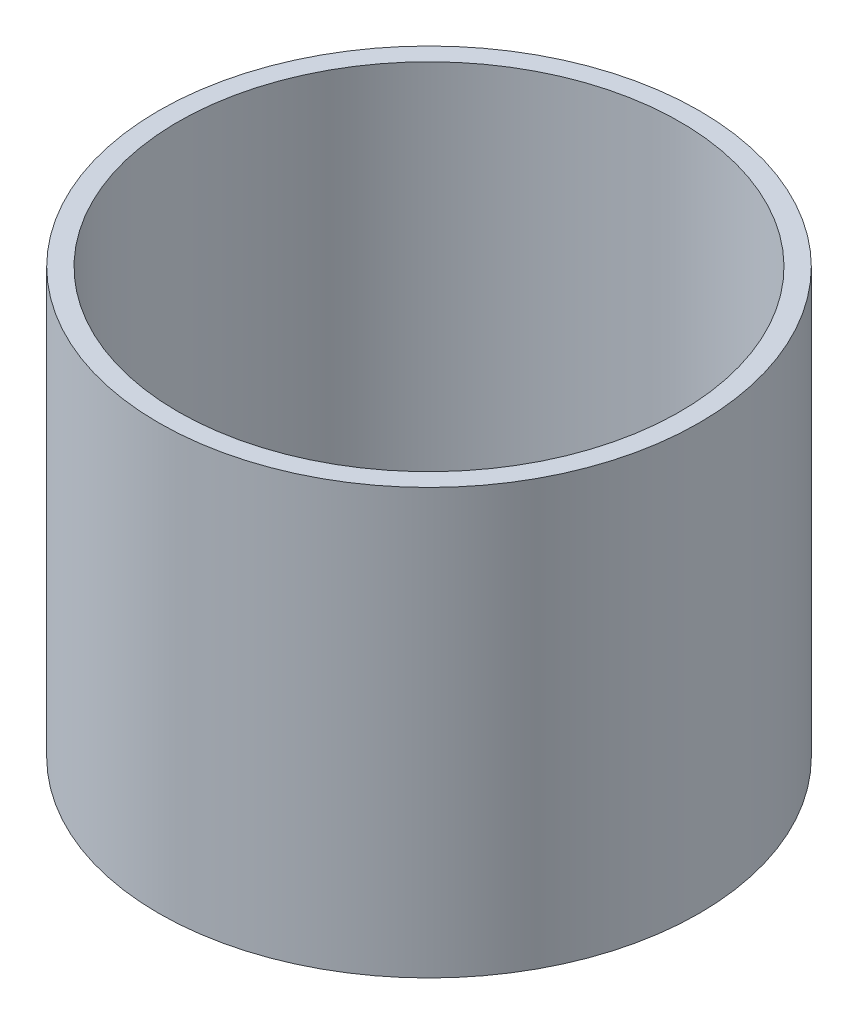
ISO-10303-21;
HEADER;
FILE_DESCRIPTION(('STEP AP214'),'2;1');
FILE_NAME('part.step','',(''),(''),'','','');
FILE_SCHEMA(('AUTOMOTIVE_DESIGN { 1 0 10303 214 1 1 1 1 }'));
ENDSEC;
DATA;
#1=APPLICATION_CONTEXT('core data for automotive mechanical design processes');
#2=APPLICATION_PROTOCOL_DEFINITION('international standard','automotive_design',2000,#1);
#3=PRODUCT_CONTEXT('',#1,'mechanical');
#4=PRODUCT('Part','Part','',(#3));
#5=PRODUCT_RELATED_PRODUCT_CATEGORY('part','',(#4));
#6=PRODUCT_DEFINITION_FORMATION('','',#4);
#7=PRODUCT_DEFINITION_CONTEXT('part definition',#1,'design');
#8=PRODUCT_DEFINITION('design','',#6,#7);
#9=PRODUCT_DEFINITION_SHAPE('','',#8);
#10=(LENGTH_UNIT() NAMED_UNIT(*) SI_UNIT(.MILLI.,.METRE.));
#11=(NAMED_UNIT(*) PLANE_ANGLE_UNIT() SI_UNIT($,.RADIAN.));
#12=(NAMED_UNIT(*) SI_UNIT($,.STERADIAN.) SOLID_ANGLE_UNIT());
#13=UNCERTAINTY_MEASURE_WITH_UNIT(LENGTH_MEASURE(1.E-05),#10,'distance_accuracy_value','');
#14=(GEOMETRIC_REPRESENTATION_CONTEXT(3) GLOBAL_UNCERTAINTY_ASSIGNED_CONTEXT((#13)) GLOBAL_UNIT_ASSIGNED_CONTEXT((#10,
#11,#12)) REPRESENTATION_CONTEXT('',''));
#15=CARTESIAN_POINT('',(0.,0.,0.));
#16=DIRECTION('',(0.,0.,1.));
#17=DIRECTION('',(1.,0.,0.));
#18=AXIS2_PLACEMENT_3D('',#15,#16,#17);
#19=CARTESIAN_POINT('',(0.,27.94,0.));
#20=DIRECTION('',(0.,-1.,0.));
#21=DIRECTION('',(0.,0.,-1.));
#22=AXIS2_PLACEMENT_3D('',#19,#20,#21);
#23=CYLINDRICAL_SURFACE('',#22,17.78);
#24=CARTESIAN_POINT('',(0.,27.94,0.));
#25=DIRECTION('',(0.,1.,0.));
#26=DIRECTION('',(0.,0.,1.));
#27=AXIS2_PLACEMENT_3D('',#24,#25,#26);
#28=CIRCLE('',#27,17.78);
#29=CARTESIAN_POINT('',(0.,27.94,17.78));
#30=VERTEX_POINT('',#29);
#31=EDGE_CURVE('E10',#30,#30,#28,.T.);
#32=ORIENTED_EDGE('',*,*,#31,.F.);
#33=EDGE_LOOP('',(#32));
#34=FACE_BOUND('',#33,.T.);
#35=CARTESIAN_POINT('',(0.,0.,0.));
#36=DIRECTION('',(0.,1.,0.));
#37=DIRECTION('',(0.,0.,1.));
#38=AXIS2_PLACEMENT_3D('',#35,#36,#37);
#39=CIRCLE('',#38,17.78);
#40=CARTESIAN_POINT('',(0.,0.,17.78));
#41=VERTEX_POINT('',#40);
#42=EDGE_CURVE('E38',#41,#41,#39,.T.);
#43=ORIENTED_EDGE('',*,*,#42,.T.);
#44=EDGE_LOOP('',(#43));
#45=FACE_BOUND('',#44,.T.);
#46=ADVANCED_FACE('F35',(#34,#45),#23,.T.);
#47=CARTESIAN_POINT('',(0.,27.94,0.));
#48=DIRECTION('',(0.,1.,0.));
#49=DIRECTION('',(0.,0.,1.));
#50=AXIS2_PLACEMENT_3D('',#47,#48,#49);
#51=PLANE('',#50);
#52=CARTESIAN_POINT('',(0.,27.94,0.));
#53=DIRECTION('',(0.,1.,0.));
#54=DIRECTION('',(0.,0.,1.));
#55=AXIS2_PLACEMENT_3D('',#52,#53,#54);
#56=CIRCLE('',#55,16.51);
#57=CARTESIAN_POINT('',(0.,27.94,16.51));
#58=VERTEX_POINT('',#57);
#59=EDGE_CURVE('E47',#58,#58,#56,.T.);
#60=ORIENTED_EDGE('',*,*,#59,.F.);
#61=EDGE_LOOP('',(#60));
#62=FACE_BOUND('',#61,.T.);
#63=ORIENTED_EDGE('',*,*,#31,.T.);
#64=EDGE_LOOP('',(#63));
#65=FACE_BOUND('',#64,.T.);
#66=ADVANCED_FACE('F62',(#62,#65),#51,.T.);
#67=CARTESIAN_POINT('',(0.,0.,0.));
#68=DIRECTION('',(0.,1.,0.));
#69=DIRECTION('',(0.,0.,1.));
#70=AXIS2_PLACEMENT_3D('',#67,#68,#69);
#71=PLANE('',#70);
#72=CARTESIAN_POINT('',(0.,0.,0.));
#73=DIRECTION('',(0.,1.,0.));
#74=DIRECTION('',(0.,0.,1.));
#75=AXIS2_PLACEMENT_3D('',#72,#73,#74);
#76=CIRCLE('',#75,16.51);
#77=CARTESIAN_POINT('',(0.,0.,16.51));
#78=VERTEX_POINT('',#77);
#79=EDGE_CURVE('E45',#78,#78,#76,.T.);
#80=ORIENTED_EDGE('',*,*,#79,.T.);
#81=EDGE_LOOP('',(#80));
#82=FACE_BOUND('',#81,.T.);
#83=ORIENTED_EDGE('',*,*,#42,.F.);
#84=EDGE_LOOP('',(#83));
#85=FACE_BOUND('',#84,.T.);
#86=ADVANCED_FACE('F53',(#82,#85),#71,.F.);
#87=CARTESIAN_POINT('',(0.,0.,0.));
#88=DIRECTION('',(0.,1.,0.));
#89=DIRECTION('',(0.,0.,1.));
#90=AXIS2_PLACEMENT_3D('',#87,#88,#89);
#91=CYLINDRICAL_SURFACE('',#90,16.51);
#92=ORIENTED_EDGE('',*,*,#79,.F.);
#93=EDGE_LOOP('',(#92));
#94=FACE_BOUND('',#93,.T.);
#95=ORIENTED_EDGE('',*,*,#59,.T.);
#96=EDGE_LOOP('',(#95));
#97=FACE_BOUND('',#96,.T.);
#98=ADVANCED_FACE('F56',(#94,#97),#91,.F.);
#99=CLOSED_SHELL('',(#46,#66,#86,#98));
#100=MANIFOLD_SOLID_BREP('B2',#99);
#101=ADVANCED_BREP_SHAPE_REPRESENTATION('',(#18,#100),#14);
#102=SHAPE_DEFINITION_REPRESENTATION(#9,#101);
ENDSEC;
END-ISO-10303-21;
